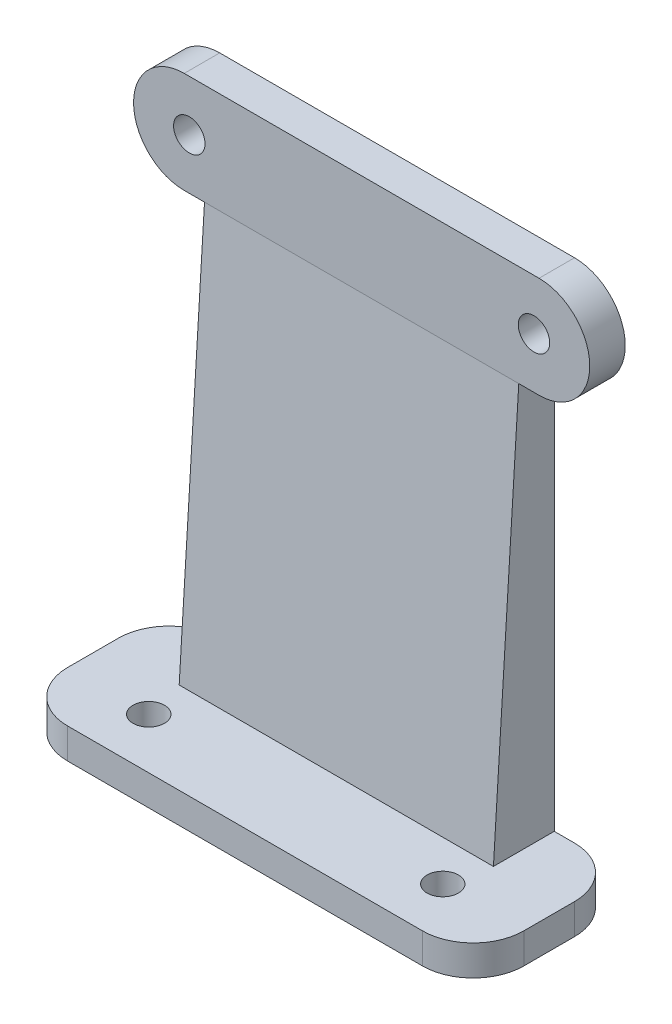
ISO-10303-21;
HEADER;
FILE_DESCRIPTION(('STEP AP214'),'2;1');
FILE_NAME('part.step','',(''),(''),'','','');
FILE_SCHEMA(('AUTOMOTIVE_DESIGN { 1 0 10303 214 1 1 1 1 }'));
ENDSEC;
DATA;
#1=APPLICATION_CONTEXT('core data for automotive mechanical design processes');
#2=APPLICATION_PROTOCOL_DEFINITION('international standard','automotive_design',2000,#1);
#3=PRODUCT_CONTEXT('',#1,'mechanical');
#4=PRODUCT('Part','Part','',(#3));
#5=PRODUCT_RELATED_PRODUCT_CATEGORY('part','',(#4));
#6=PRODUCT_DEFINITION_FORMATION('','',#4);
#7=PRODUCT_DEFINITION_CONTEXT('part definition',#1,'design');
#8=PRODUCT_DEFINITION('design','',#6,#7);
#9=PRODUCT_DEFINITION_SHAPE('','',#8);
#10=(LENGTH_UNIT() NAMED_UNIT(*) SI_UNIT(.MILLI.,.METRE.));
#11=(NAMED_UNIT(*) PLANE_ANGLE_UNIT() SI_UNIT($,.RADIAN.));
#12=(NAMED_UNIT(*) SI_UNIT($,.STERADIAN.) SOLID_ANGLE_UNIT());
#13=UNCERTAINTY_MEASURE_WITH_UNIT(LENGTH_MEASURE(1.E-05),#10,'distance_accuracy_value','');
#14=(GEOMETRIC_REPRESENTATION_CONTEXT(3) GLOBAL_UNCERTAINTY_ASSIGNED_CONTEXT((#13)) GLOBAL_UNIT_ASSIGNED_CONTEXT((#10,
#11,#12)) REPRESENTATION_CONTEXT('',''));
#15=CARTESIAN_POINT('',(0.,0.,0.));
#16=DIRECTION('',(0.,0.,1.));
#17=DIRECTION('',(1.,0.,0.));
#18=AXIS2_PLACEMENT_3D('',#15,#16,#17);
#19=CARTESIAN_POINT('',(0.,2.,0.));
#20=DIRECTION('',(0.,1.,0.));
#21=DIRECTION('',(0.,0.,1.));
#22=AXIS2_PLACEMENT_3D('',#19,#20,#21);
#23=PLANE('',#22);
#24=CARTESIAN_POINT('',(37.,2.,10.));
#25=DIRECTION('',(0.,1.,0.));
#26=DIRECTION('',(0.,0.,1.));
#27=AXIS2_PLACEMENT_3D('',#24,#25,#26);
#28=CIRCLE('',#27,1.55);
#29=CARTESIAN_POINT('',(37.,2.,11.55));
#30=VERTEX_POINT('',#29);
#31=EDGE_CURVE('E215',#30,#30,#28,.T.);
#32=ORIENTED_EDGE('',*,*,#31,.F.);
#33=EDGE_LOOP('',(#32));
#34=FACE_BOUND('',#33,.T.);
#35=CARTESIAN_POINT('',(8.,2.,10.));
#36=DIRECTION('',(0.,1.,0.));
#37=DIRECTION('',(0.,0.,1.));
#38=AXIS2_PLACEMENT_3D('',#35,#36,#37);
#39=CIRCLE('',#38,1.55);
#40=CARTESIAN_POINT('',(8.,2.,11.55));
#41=VERTEX_POINT('',#40);
#42=EDGE_CURVE('E209',#41,#41,#39,.T.);
#43=ORIENTED_EDGE('',*,*,#42,.F.);
#44=EDGE_LOOP('',(#43));
#45=FACE_BOUND('',#44,.T.);
#46=DIRECTION('',(1.,0.,0.));
#47=VECTOR('',#46,1.);
#48=CARTESIAN_POINT('',(0.,2.,15.));
#49=LINE('',#48,#47);
#50=CARTESIAN_POINT('',(5.,2.,15.));
#51=VERTEX_POINT('',#50);
#52=CARTESIAN_POINT('',(40.,2.,15.));
#53=VERTEX_POINT('',#52);
#54=EDGE_CURVE('E226',#51,#53,#49,.T.);
#55=ORIENTED_EDGE('',*,*,#54,.T.);
#56=CARTESIAN_POINT('',(40.,2.,10.));
#57=DIRECTION('',(0.,1.,0.));
#58=DIRECTION('',(0.,0.,1.));
#59=AXIS2_PLACEMENT_3D('',#56,#57,#58);
#60=CIRCLE('',#59,5.);
#61=CARTESIAN_POINT('',(45.,2.,10.));
#62=VERTEX_POINT('',#61);
#63=EDGE_CURVE('E280',#53,#62,#60,.T.);
#64=ORIENTED_EDGE('',*,*,#63,.T.);
#65=DIRECTION('',(0.,0.,-1.));
#66=VECTOR('',#65,1.);
#67=CARTESIAN_POINT('',(45.,2.,0.));
#68=LINE('',#67,#66);
#69=CARTESIAN_POINT('',(45.,2.,5.));
#70=VERTEX_POINT('',#69);
#71=EDGE_CURVE('E229',#62,#70,#68,.T.);
#72=ORIENTED_EDGE('',*,*,#71,.T.);
#73=CARTESIAN_POINT('',(40.,2.,5.));
#74=DIRECTION('',(0.,1.,0.));
#75=DIRECTION('',(0.,0.,1.));
#76=AXIS2_PLACEMENT_3D('',#73,#74,#75);
#77=CIRCLE('',#76,5.);
#78=CARTESIAN_POINT('',(40.,2.,0.));
#79=VERTEX_POINT('',#78);
#80=EDGE_CURVE('E276',#70,#79,#77,.T.);
#81=ORIENTED_EDGE('',*,*,#80,.T.);
#82=DIRECTION('',(-1.,0.,0.));
#83=VECTOR('',#82,1.);
#84=CARTESIAN_POINT('',(38.,2.,0.));
#85=LINE('',#84,#83);
#86=CARTESIAN_POINT('',(38.,2.,0.));
#87=VERTEX_POINT('',#86);
#88=EDGE_CURVE('E172',#79,#87,#85,.T.);
#89=ORIENTED_EDGE('',*,*,#88,.T.);
#90=DIRECTION('',(0.,0.,-1.));
#91=VECTOR('',#90,1.);
#92=CARTESIAN_POINT('',(38.,2.,10.));
#93=LINE('',#92,#91);
#94=CARTESIAN_POINT('',(38.,2.,6.));
#95=VERTEX_POINT('',#94);
#96=EDGE_CURVE('E160',#95,#87,#93,.T.);
#97=ORIENTED_EDGE('',*,*,#96,.F.);
#98=DIRECTION('',(-1.,0.,0.));
#99=VECTOR('',#98,1.);
#100=CARTESIAN_POINT('',(78.0780488547035,1.99999999999997,6.));
#101=LINE('',#100,#99);
#102=CARTESIAN_POINT('',(6.99999999999999,2.,6.));
#103=VERTEX_POINT('',#102);
#104=EDGE_CURVE('E306',#95,#103,#101,.T.);
#105=ORIENTED_EDGE('',*,*,#104,.T.);
#106=DIRECTION('',(0.,0.,-1.));
#107=VECTOR('',#106,1.);
#108=CARTESIAN_POINT('',(6.99999999999999,2.,10.));
#109=LINE('',#108,#107);
#110=CARTESIAN_POINT('',(6.99999999999999,2.,0.));
#111=VERTEX_POINT('',#110);
#112=EDGE_CURVE('E195',#103,#111,#109,.T.);
#113=ORIENTED_EDGE('',*,*,#112,.T.);
#114=DIRECTION('',(-1.,0.,0.));
#115=VECTOR('',#114,1.);
#116=CARTESIAN_POINT('',(6.99999999999999,2.,0.));
#117=LINE('',#116,#115);
#118=CARTESIAN_POINT('',(5.,2.,0.));
#119=VERTEX_POINT('',#118);
#120=EDGE_CURVE('E188',#111,#119,#117,.T.);
#121=ORIENTED_EDGE('',*,*,#120,.T.);
#122=CARTESIAN_POINT('',(5.,2.,5.));
#123=DIRECTION('',(0.,1.,0.));
#124=DIRECTION('',(0.,0.,1.));
#125=AXIS2_PLACEMENT_3D('',#122,#123,#124);
#126=CIRCLE('',#125,5.);
#127=CARTESIAN_POINT('',(0.,2.,5.));
#128=VERTEX_POINT('',#127);
#129=EDGE_CURVE('E274',#119,#128,#126,.T.);
#130=ORIENTED_EDGE('',*,*,#129,.T.);
#131=DIRECTION('',(0.,0.,1.));
#132=VECTOR('',#131,1.);
#133=CARTESIAN_POINT('',(0.,2.,0.));
#134=LINE('',#133,#132);
#135=CARTESIAN_POINT('',(0.,2.,10.));
#136=VERTEX_POINT('',#135);
#137=EDGE_CURVE('E223',#128,#136,#134,.T.);
#138=ORIENTED_EDGE('',*,*,#137,.T.);
#139=CARTESIAN_POINT('',(5.,2.,10.));
#140=DIRECTION('',(0.,1.,0.));
#141=DIRECTION('',(0.,0.,1.));
#142=AXIS2_PLACEMENT_3D('',#139,#140,#141);
#143=CIRCLE('',#142,5.);
#144=EDGE_CURVE('E278',#136,#51,#143,.T.);
#145=ORIENTED_EDGE('',*,*,#144,.T.);
#146=EDGE_LOOP('',(#55,#64,#72,#81,#89,#97,#105,#113,#121,#130,#138,#145));
#147=FACE_BOUND('',#146,.T.);
#148=ADVANCED_FACE('F40',(#34,#45,#147),#23,.T.);
#149=CARTESIAN_POINT('',(5.,47.,0.));
#150=DIRECTION('',(0.,0.,1.));
#151=DIRECTION('',(1.,0.,0.));
#152=AXIS2_PLACEMENT_3D('',#149,#150,#151);
#153=CYLINDRICAL_SURFACE('',#152,5.);
#154=DIRECTION('',(0.,0.,1.));
#155=VECTOR('',#154,1.);
#156=CARTESIAN_POINT('',(5.,52.,0.));
#157=LINE('',#156,#155);
#158=CARTESIAN_POINT('',(5.,52.,0.));
#159=VERTEX_POINT('',#158);
#160=CARTESIAN_POINT('',(4.99999999999999,52.,3.5));
#161=VERTEX_POINT('',#160);
#162=EDGE_CURVE('E259',#159,#161,#157,.T.);
#163=ORIENTED_EDGE('',*,*,#162,.F.);
#164=CARTESIAN_POINT('',(5.,47.,0.));
#165=DIRECTION('',(0.,0.,-1.));
#166=DIRECTION('',(-1.,0.,0.));
#167=AXIS2_PLACEMENT_3D('',#164,#165,#166);
#168=CIRCLE('',#167,5.);
#169=CARTESIAN_POINT('',(5.,42.,0.));
#170=VERTEX_POINT('',#169);
#171=EDGE_CURVE('E265',#170,#159,#168,.T.);
#172=ORIENTED_EDGE('',*,*,#171,.F.);
#173=DIRECTION('',(0.,0.,-1.));
#174=VECTOR('',#173,1.);
#175=CARTESIAN_POINT('',(5.,42.,0.));
#176=LINE('',#175,#174);
#177=CARTESIAN_POINT('',(5.,42.,3.5));
#178=VERTEX_POINT('',#177);
#179=EDGE_CURVE('E262',#178,#170,#176,.T.);
#180=ORIENTED_EDGE('',*,*,#179,.F.);
#181=CARTESIAN_POINT('',(5.,47.,3.5));
#182=DIRECTION('',(0.,0.,-1.));
#183=DIRECTION('',(-1.,0.,0.));
#184=AXIS2_PLACEMENT_3D('',#181,#182,#183);
#185=CIRCLE('',#184,5.);
#186=EDGE_CURVE('E267',#161,#178,#185,.F.);
#187=ORIENTED_EDGE('',*,*,#186,.F.);
#188=EDGE_LOOP('',(#163,#172,#180,#187));
#189=FACE_BOUND('',#188,.T.);
#190=ADVANCED_FACE('F320',(#189),#153,.T.);
#191=CARTESIAN_POINT('',(40.,47.,3.5));
#192=DIRECTION('',(0.,0.,-1.));
#193=DIRECTION('',(-1.,0.,0.));
#194=AXIS2_PLACEMENT_3D('',#191,#192,#193);
#195=CYLINDRICAL_SURFACE('',#194,5.);
#196=DIRECTION('',(0.,0.,-1.));
#197=VECTOR('',#196,1.);
#198=CARTESIAN_POINT('',(40.,52.,0.));
#199=LINE('',#198,#197);
#200=CARTESIAN_POINT('',(40.,52.,3.5));
#201=VERTEX_POINT('',#200);
#202=CARTESIAN_POINT('',(40.,52.,0.));
#203=VERTEX_POINT('',#202);
#204=EDGE_CURVE('E250',#201,#203,#199,.T.);
#205=ORIENTED_EDGE('',*,*,#204,.F.);
#206=CARTESIAN_POINT('',(40.,47.,3.5));
#207=DIRECTION('',(0.,0.,-1.));
#208=DIRECTION('',(-1.,0.,0.));
#209=AXIS2_PLACEMENT_3D('',#206,#207,#208);
#210=CIRCLE('',#209,5.);
#211=CARTESIAN_POINT('',(40.,42.,3.5));
#212=VERTEX_POINT('',#211);
#213=EDGE_CURVE('E255',#212,#201,#210,.F.);
#214=ORIENTED_EDGE('',*,*,#213,.F.);
#215=DIRECTION('',(0.,0.,1.));
#216=VECTOR('',#215,1.);
#217=CARTESIAN_POINT('',(40.,42.,3.5));
#218=LINE('',#217,#216);
#219=CARTESIAN_POINT('',(40.,42.,0.));
#220=VERTEX_POINT('',#219);
#221=EDGE_CURVE('E253',#220,#212,#218,.T.);
#222=ORIENTED_EDGE('',*,*,#221,.F.);
#223=CARTESIAN_POINT('',(40.,47.,0.));
#224=DIRECTION('',(0.,0.,-1.));
#225=DIRECTION('',(-1.,0.,0.));
#226=AXIS2_PLACEMENT_3D('',#223,#224,#225);
#227=CIRCLE('',#226,5.);
#228=EDGE_CURVE('E177',#203,#220,#227,.T.);
#229=ORIENTED_EDGE('',*,*,#228,.F.);
#230=EDGE_LOOP('',(#205,#214,#222,#229));
#231=FACE_BOUND('',#230,.T.);
#232=ADVANCED_FACE('F326',(#231),#195,.T.);
#233=CARTESIAN_POINT('',(45.,-1.,0.));
#234=DIRECTION('',(1.,0.,0.));
#235=DIRECTION('',(0.,0.,-1.));
#236=AXIS2_PLACEMENT_3D('',#233,#234,#235);
#237=PLANE('',#236);
#238=ORIENTED_EDGE('',*,*,#71,.F.);
#239=DIRECTION('',(0.,1.,0.));
#240=VECTOR('',#239,1.);
#241=CARTESIAN_POINT('',(45.,-1.,10.));
#242=LINE('',#241,#240);
#243=CARTESIAN_POINT('',(45.,-1.,10.));
#244=VERTEX_POINT('',#243);
#245=EDGE_CURVE('E285',#62,#244,#242,.F.);
#246=ORIENTED_EDGE('',*,*,#245,.T.);
#247=DIRECTION('',(0.,0.,-1.));
#248=VECTOR('',#247,1.);
#249=CARTESIAN_POINT('',(45.,-1.,0.));
#250=LINE('',#249,#248);
#251=CARTESIAN_POINT('',(45.,-1.,5.));
#252=VERTEX_POINT('',#251);
#253=EDGE_CURVE('E238',#244,#252,#250,.T.);
#254=ORIENTED_EDGE('',*,*,#253,.T.);
#255=DIRECTION('',(0.,1.,0.));
#256=VECTOR('',#255,1.);
#257=CARTESIAN_POINT('',(45.,-1.,5.));
#258=LINE('',#257,#256);
#259=EDGE_CURVE('E282',#252,#70,#258,.T.);
#260=ORIENTED_EDGE('',*,*,#259,.T.);
#261=EDGE_LOOP('',(#238,#246,#254,#260));
#262=FACE_BOUND('',#261,.T.);
#263=ADVANCED_FACE('F367',(#262),#237,.T.);
#264=CARTESIAN_POINT('',(0.,-1.,0.));
#265=DIRECTION('',(0.,0.,-1.));
#266=DIRECTION('',(-1.,0.,0.));
#267=AXIS2_PLACEMENT_3D('',#264,#265,#266);
#268=PLANE('',#267);
#269=ORIENTED_EDGE('',*,*,#88,.F.);
#270=DIRECTION('',(0.,1.,0.));
#271=VECTOR('',#270,1.);
#272=CARTESIAN_POINT('',(40.,-1.,0.));
#273=LINE('',#272,#271);
#274=CARTESIAN_POINT('',(40.,-1.,0.));
#275=VERTEX_POINT('',#274);
#276=EDGE_CURVE('E11',#79,#275,#273,.F.);
#277=ORIENTED_EDGE('',*,*,#276,.T.);
#278=DIRECTION('',(-1.,0.,0.));
#279=VECTOR('',#278,1.);
#280=CARTESIAN_POINT('',(0.,-1.,0.));
#281=LINE('',#280,#279);
#282=CARTESIAN_POINT('',(5.,-1.,0.));
#283=VERTEX_POINT('',#282);
#284=EDGE_CURVE('E241',#275,#283,#281,.T.);
#285=ORIENTED_EDGE('',*,*,#284,.T.);
#286=DIRECTION('',(0.,1.,0.));
#287=VECTOR('',#286,1.);
#288=CARTESIAN_POINT('',(5.,-1.,0.));
#289=LINE('',#288,#287);
#290=EDGE_CURVE('E48',#283,#119,#289,.T.);
#291=ORIENTED_EDGE('',*,*,#290,.T.);
#292=ORIENTED_EDGE('',*,*,#120,.F.);
#293=DIRECTION('',(0.,-1.,0.));
#294=VECTOR('',#293,1.);
#295=CARTESIAN_POINT('',(7.,42.,0.));
#296=LINE('',#295,#294);
#297=CARTESIAN_POINT('',(7.,42.,0.));
#298=VERTEX_POINT('',#297);
#299=EDGE_CURVE('E185',#298,#111,#296,.T.);
#300=ORIENTED_EDGE('',*,*,#299,.F.);
#301=DIRECTION('',(1.,0.,0.));
#302=VECTOR('',#301,1.);
#303=CARTESIAN_POINT('',(7.,42.,0.));
#304=LINE('',#303,#302);
#305=EDGE_CURVE('E192',#170,#298,#304,.T.);
#306=ORIENTED_EDGE('',*,*,#305,.F.);
#307=ORIENTED_EDGE('',*,*,#171,.T.);
#308=DIRECTION('',(-1.,0.,0.));
#309=VECTOR('',#308,1.);
#310=CARTESIAN_POINT('',(0.,52.,0.));
#311=LINE('',#310,#309);
#312=EDGE_CURVE('E220',#203,#159,#311,.T.);
#313=ORIENTED_EDGE('',*,*,#312,.F.);
#314=ORIENTED_EDGE('',*,*,#228,.T.);
#315=DIRECTION('',(1.,0.,0.));
#316=VECTOR('',#315,1.);
#317=CARTESIAN_POINT('',(38.,42.,0.));
#318=LINE('',#317,#316);
#319=CARTESIAN_POINT('',(38.,42.,0.));
#320=VERTEX_POINT('',#319);
#321=EDGE_CURVE('E162',#320,#220,#318,.T.);
#322=ORIENTED_EDGE('',*,*,#321,.F.);
#323=DIRECTION('',(0.,1.,0.));
#324=VECTOR('',#323,1.);
#325=CARTESIAN_POINT('',(38.,42.,0.));
#326=LINE('',#325,#324);
#327=EDGE_CURVE('E154',#87,#320,#326,.T.);
#328=ORIENTED_EDGE('',*,*,#327,.F.);
#329=EDGE_LOOP('',(#269,#277,#285,#291,#292,#300,#306,#307,#313,#314,#322,#328));
#330=FACE_BOUND('',#329,.T.);
#331=CARTESIAN_POINT('',(39.5,47.,0.));
#332=DIRECTION('',(0.,0.,-1.));
#333=DIRECTION('',(-1.,0.,0.));
#334=AXIS2_PLACEMENT_3D('',#331,#332,#333);
#335=CIRCLE('',#334,1.55);
#336=CARTESIAN_POINT('',(37.95,47.,0.));
#337=VERTEX_POINT('',#336);
#338=EDGE_CURVE('E199',#337,#337,#335,.T.);
#339=ORIENTED_EDGE('',*,*,#338,.F.);
#340=EDGE_LOOP('',(#339));
#341=FACE_BOUND('',#340,.T.);
#342=CARTESIAN_POINT('',(5.5,47.,0.));
#343=DIRECTION('',(0.,0.,-1.));
#344=DIRECTION('',(-1.,0.,0.));
#345=AXIS2_PLACEMENT_3D('',#342,#343,#344);
#346=CIRCLE('',#345,1.55);
#347=CARTESIAN_POINT('',(3.95,47.,0.));
#348=VERTEX_POINT('',#347);
#349=EDGE_CURVE('E183',#348,#348,#346,.T.);
#350=ORIENTED_EDGE('',*,*,#349,.F.);
#351=EDGE_LOOP('',(#350));
#352=FACE_BOUND('',#351,.T.);
#353=ADVANCED_FACE('F174',(#330,#341,#352),#268,.T.);
#354=CARTESIAN_POINT('',(0.,-1.,0.));
#355=DIRECTION('',(-1.,0.,0.));
#356=DIRECTION('',(0.,0.,1.));
#357=AXIS2_PLACEMENT_3D('',#354,#355,#356);
#358=PLANE('',#357);
#359=DIRECTION('',(0.,0.,1.));
#360=VECTOR('',#359,1.);
#361=CARTESIAN_POINT('',(0.,-1.,0.));
#362=LINE('',#361,#360);
#363=CARTESIAN_POINT('',(0.,-1.,5.));
#364=VERTEX_POINT('',#363);
#365=CARTESIAN_POINT('',(0.,-1.,10.));
#366=VERTEX_POINT('',#365);
#367=EDGE_CURVE('E232',#364,#366,#362,.T.);
#368=ORIENTED_EDGE('',*,*,#367,.T.);
#369=DIRECTION('',(0.,1.,0.));
#370=VECTOR('',#369,1.);
#371=CARTESIAN_POINT('',(0.,-1.,10.));
#372=LINE('',#371,#370);
#373=EDGE_CURVE('E296',#366,#136,#372,.T.);
#374=ORIENTED_EDGE('',*,*,#373,.T.);
#375=ORIENTED_EDGE('',*,*,#137,.F.);
#376=DIRECTION('',(0.,1.,0.));
#377=VECTOR('',#376,1.);
#378=CARTESIAN_POINT('',(0.,-1.,5.));
#379=LINE('',#378,#377);
#380=EDGE_CURVE('E294',#128,#364,#379,.F.);
#381=ORIENTED_EDGE('',*,*,#380,.T.);
#382=EDGE_LOOP('',(#368,#374,#375,#381));
#383=FACE_BOUND('',#382,.T.);
#384=ADVANCED_FACE('F366',(#383),#358,.T.);
#385=CARTESIAN_POINT('',(0.,-1.,15.));
#386=DIRECTION('',(0.,0.,1.));
#387=DIRECTION('',(1.,0.,0.));
#388=AXIS2_PLACEMENT_3D('',#385,#386,#387);
#389=PLANE('',#388);
#390=DIRECTION('',(1.,0.,0.));
#391=VECTOR('',#390,1.);
#392=CARTESIAN_POINT('',(0.,-1.,15.));
#393=LINE('',#392,#391);
#394=CARTESIAN_POINT('',(5.,-1.,15.));
#395=VERTEX_POINT('',#394);
#396=CARTESIAN_POINT('',(40.,-1.,15.));
#397=VERTEX_POINT('',#396);
#398=EDGE_CURVE('E235',#395,#397,#393,.T.);
#399=ORIENTED_EDGE('',*,*,#398,.T.);
#400=DIRECTION('',(0.,1.,0.));
#401=VECTOR('',#400,1.);
#402=CARTESIAN_POINT('',(40.,-1.,15.));
#403=LINE('',#402,#401);
#404=EDGE_CURVE('E271',#397,#53,#403,.T.);
#405=ORIENTED_EDGE('',*,*,#404,.T.);
#406=ORIENTED_EDGE('',*,*,#54,.F.);
#407=DIRECTION('',(0.,1.,0.));
#408=VECTOR('',#407,1.);
#409=CARTESIAN_POINT('',(5.,-1.,15.));
#410=LINE('',#409,#408);
#411=EDGE_CURVE('E269',#51,#395,#410,.F.);
#412=ORIENTED_EDGE('',*,*,#411,.T.);
#413=EDGE_LOOP('',(#399,#405,#406,#412));
#414=FACE_BOUND('',#413,.T.);
#415=ADVANCED_FACE('F362',(#414),#389,.T.);
#416=CARTESIAN_POINT('',(0.,-1.,0.));
#417=DIRECTION('',(0.,1.,0.));
#418=DIRECTION('',(0.,0.,1.));
#419=AXIS2_PLACEMENT_3D('',#416,#417,#418);
#420=PLANE('',#419);
#421=CARTESIAN_POINT('',(8.,-1.,10.));
#422=DIRECTION('',(0.,1.,0.));
#423=DIRECTION('',(0.,0.,1.));
#424=AXIS2_PLACEMENT_3D('',#421,#422,#423);
#425=CIRCLE('',#424,1.55);
#426=CARTESIAN_POINT('',(8.,-1.,11.55));
#427=VERTEX_POINT('',#426);
#428=EDGE_CURVE('E205',#427,#427,#425,.T.);
#429=ORIENTED_EDGE('',*,*,#428,.T.);
#430=EDGE_LOOP('',(#429));
#431=FACE_BOUND('',#430,.T.);
#432=CARTESIAN_POINT('',(37.,-1.,10.));
#433=DIRECTION('',(0.,1.,0.));
#434=DIRECTION('',(0.,0.,1.));
#435=AXIS2_PLACEMENT_3D('',#432,#433,#434);
#436=CIRCLE('',#435,1.55);
#437=CARTESIAN_POINT('',(37.,-1.,11.55));
#438=VERTEX_POINT('',#437);
#439=EDGE_CURVE('E212',#438,#438,#436,.T.);
#440=ORIENTED_EDGE('',*,*,#439,.T.);
#441=EDGE_LOOP('',(#440));
#442=FACE_BOUND('',#441,.T.);
#443=ORIENTED_EDGE('',*,*,#253,.F.);
#444=CARTESIAN_POINT('',(40.,-1.,10.));
#445=DIRECTION('',(0.,1.,0.));
#446=DIRECTION('',(0.,0.,1.));
#447=AXIS2_PLACEMENT_3D('',#444,#445,#446);
#448=CIRCLE('',#447,5.);
#449=EDGE_CURVE('E292',#244,#397,#448,.F.);
#450=ORIENTED_EDGE('',*,*,#449,.T.);
#451=ORIENTED_EDGE('',*,*,#398,.F.);
#452=CARTESIAN_POINT('',(5.,-1.,10.));
#453=DIRECTION('',(0.,1.,0.));
#454=DIRECTION('',(0.,0.,1.));
#455=AXIS2_PLACEMENT_3D('',#452,#453,#454);
#456=CIRCLE('',#455,5.);
#457=EDGE_CURVE('E290',#395,#366,#456,.F.);
#458=ORIENTED_EDGE('',*,*,#457,.T.);
#459=ORIENTED_EDGE('',*,*,#367,.F.);
#460=CARTESIAN_POINT('',(5.,-1.,5.));
#461=DIRECTION('',(0.,1.,0.));
#462=DIRECTION('',(0.,0.,1.));
#463=AXIS2_PLACEMENT_3D('',#460,#461,#462);
#464=CIRCLE('',#463,5.);
#465=EDGE_CURVE('E55',#364,#283,#464,.F.);
#466=ORIENTED_EDGE('',*,*,#465,.T.);
#467=ORIENTED_EDGE('',*,*,#284,.F.);
#468=CARTESIAN_POINT('',(40.,-1.,5.));
#469=DIRECTION('',(0.,1.,0.));
#470=DIRECTION('',(0.,0.,1.));
#471=AXIS2_PLACEMENT_3D('',#468,#469,#470);
#472=CIRCLE('',#471,5.);
#473=EDGE_CURVE('E288',#275,#252,#472,.F.);
#474=ORIENTED_EDGE('',*,*,#473,.T.);
#475=EDGE_LOOP('',(#443,#450,#451,#458,#459,#466,#467,#474));
#476=FACE_BOUND('',#475,.T.);
#477=ADVANCED_FACE('F359',(#431,#442,#476),#420,.F.);
#478=CARTESIAN_POINT('',(0.,52.,3.5));
#479=DIRECTION('',(0.,0.,-1.));
#480=DIRECTION('',(-1.,0.,0.));
#481=AXIS2_PLACEMENT_3D('',#478,#479,#480);
#482=PLANE('',#481);
#483=CARTESIAN_POINT('',(39.5,47.,3.5));
#484=DIRECTION('',(0.,0.,-1.));
#485=DIRECTION('',(-1.,0.,0.));
#486=AXIS2_PLACEMENT_3D('',#483,#484,#485);
#487=CIRCLE('',#486,1.55);
#488=CARTESIAN_POINT('',(37.95,47.,3.5));
#489=VERTEX_POINT('',#488);
#490=EDGE_CURVE('E218',#489,#489,#487,.T.);
#491=ORIENTED_EDGE('',*,*,#490,.T.);
#492=EDGE_LOOP('',(#491));
#493=FACE_BOUND('',#492,.T.);
#494=CARTESIAN_POINT('',(5.5,47.,3.5));
#495=DIRECTION('',(0.,0.,-1.));
#496=DIRECTION('',(-1.,0.,0.));
#497=AXIS2_PLACEMENT_3D('',#494,#495,#496);
#498=CIRCLE('',#497,1.55);
#499=CARTESIAN_POINT('',(3.95,47.,3.5));
#500=VERTEX_POINT('',#499);
#501=EDGE_CURVE('E202',#500,#500,#498,.T.);
#502=ORIENTED_EDGE('',*,*,#501,.T.);
#503=EDGE_LOOP('',(#502));
#504=FACE_BOUND('',#503,.T.);
#505=DIRECTION('',(1.,0.,0.));
#506=VECTOR('',#505,1.);
#507=CARTESIAN_POINT('',(0.,42.,3.5));
#508=LINE('',#507,#506);
#509=CARTESIAN_POINT('',(7.,42.,3.5));
#510=VERTEX_POINT('',#509);
#511=EDGE_CURVE('E243',#178,#510,#508,.T.);
#512=ORIENTED_EDGE('',*,*,#511,.T.);
#513=DIRECTION('',(-1.,0.,0.));
#514=VECTOR('',#513,1.);
#515=CARTESIAN_POINT('',(78.0780488547035,42.,3.5));
#516=LINE('',#515,#514);
#517=CARTESIAN_POINT('',(38.,42.,3.5));
#518=VERTEX_POINT('',#517);
#519=EDGE_CURVE('E329',#518,#510,#516,.T.);
#520=ORIENTED_EDGE('',*,*,#519,.F.);
#521=DIRECTION('',(1.,0.,0.));
#522=VECTOR('',#521,1.);
#523=CARTESIAN_POINT('',(0.,42.,3.5));
#524=LINE('',#523,#522);
#525=EDGE_CURVE('E171',#518,#212,#524,.T.);
#526=ORIENTED_EDGE('',*,*,#525,.T.);
#527=ORIENTED_EDGE('',*,*,#213,.T.);
#528=DIRECTION('',(1.,0.,0.));
#529=VECTOR('',#528,1.);
#530=CARTESIAN_POINT('',(0.,52.,3.5));
#531=LINE('',#530,#529);
#532=EDGE_CURVE('E208',#161,#201,#531,.T.);
#533=ORIENTED_EDGE('',*,*,#532,.F.);
#534=ORIENTED_EDGE('',*,*,#186,.T.);
#535=EDGE_LOOP('',(#512,#520,#526,#527,#533,#534));
#536=FACE_BOUND('',#535,.T.);
#537=ADVANCED_FACE('F328',(#493,#504,#536),#482,.F.);
#538=CARTESIAN_POINT('',(0.,52.,0.));
#539=DIRECTION('',(0.,1.,0.));
#540=DIRECTION('',(0.,0.,1.));
#541=AXIS2_PLACEMENT_3D('',#538,#539,#540);
#542=PLANE('',#541);
#543=ORIENTED_EDGE('',*,*,#312,.T.);
#544=ORIENTED_EDGE('',*,*,#162,.T.);
#545=ORIENTED_EDGE('',*,*,#532,.T.);
#546=ORIENTED_EDGE('',*,*,#204,.T.);
#547=EDGE_LOOP('',(#543,#544,#545,#546));
#548=FACE_BOUND('',#547,.T.);
#549=ADVANCED_FACE('F322',(#548),#542,.T.);
#550=CARTESIAN_POINT('',(37.,-1.,10.));
#551=DIRECTION('',(0.,1.,0.));
#552=DIRECTION('',(0.,0.,1.));
#553=AXIS2_PLACEMENT_3D('',#550,#551,#552);
#554=CYLINDRICAL_SURFACE('',#553,1.55);
#555=ORIENTED_EDGE('',*,*,#439,.F.);
#556=EDGE_LOOP('',(#555));
#557=FACE_BOUND('',#556,.T.);
#558=ORIENTED_EDGE('',*,*,#31,.T.);
#559=EDGE_LOOP('',(#558));
#560=FACE_BOUND('',#559,.T.);
#561=ADVANCED_FACE('F532',(#557,#560),#554,.F.);
#562=CARTESIAN_POINT('',(8.,-1.,10.));
#563=DIRECTION('',(0.,1.,0.));
#564=DIRECTION('',(0.,0.,1.));
#565=AXIS2_PLACEMENT_3D('',#562,#563,#564);
#566=CYLINDRICAL_SURFACE('',#565,1.55);
#567=ORIENTED_EDGE('',*,*,#428,.F.);
#568=EDGE_LOOP('',(#567));
#569=FACE_BOUND('',#568,.T.);
#570=ORIENTED_EDGE('',*,*,#42,.T.);
#571=EDGE_LOOP('',(#570));
#572=FACE_BOUND('',#571,.T.);
#573=ADVANCED_FACE('F538',(#569,#572),#566,.F.);
#574=CARTESIAN_POINT('',(5.5,47.,15.));
#575=DIRECTION('',(0.,0.,-1.));
#576=DIRECTION('',(-1.,0.,0.));
#577=AXIS2_PLACEMENT_3D('',#574,#575,#576);
#578=CYLINDRICAL_SURFACE('',#577,1.55);
#579=ORIENTED_EDGE('',*,*,#349,.T.);
#580=EDGE_LOOP('',(#579));
#581=FACE_BOUND('',#580,.T.);
#582=ORIENTED_EDGE('',*,*,#501,.F.);
#583=EDGE_LOOP('',(#582));
#584=FACE_BOUND('',#583,.T.);
#585=ADVANCED_FACE('F543',(#581,#584),#578,.F.);
#586=CARTESIAN_POINT('',(39.5,47.,15.));
#587=DIRECTION('',(0.,0.,-1.));
#588=DIRECTION('',(-1.,0.,0.));
#589=AXIS2_PLACEMENT_3D('',#586,#587,#588);
#590=CYLINDRICAL_SURFACE('',#589,1.55);
#591=ORIENTED_EDGE('',*,*,#338,.T.);
#592=EDGE_LOOP('',(#591));
#593=FACE_BOUND('',#592,.T.);
#594=ORIENTED_EDGE('',*,*,#490,.F.);
#595=EDGE_LOOP('',(#594));
#596=FACE_BOUND('',#595,.T.);
#597=ADVANCED_FACE('F504',(#593,#596),#590,.F.);
#598=CARTESIAN_POINT('',(38.,42.,-10.));
#599=DIRECTION('',(-1.,0.,0.));
#600=DIRECTION('',(0.,0.,1.));
#601=AXIS2_PLACEMENT_3D('',#598,#599,#600);
#602=PLANE('',#601);
#603=ORIENTED_EDGE('',*,*,#327,.T.);
#604=DIRECTION('',(0.,0.,-1.));
#605=VECTOR('',#604,1.);
#606=CARTESIAN_POINT('',(38.,42.,10.));
#607=LINE('',#606,#605);
#608=EDGE_CURVE('E158',#518,#320,#607,.T.);
#609=ORIENTED_EDGE('',*,*,#608,.F.);
#610=DIRECTION('',(0.,-0.998052578482889,0.0623782861551805));
#611=VECTOR('',#610,1.);
#612=CARTESIAN_POINT('',(38.,42.,3.5));
#613=LINE('',#612,#611);
#614=EDGE_CURVE('E189',#518,#95,#613,.T.);
#615=ORIENTED_EDGE('',*,*,#614,.T.);
#616=ORIENTED_EDGE('',*,*,#96,.T.);
#617=EDGE_LOOP('',(#603,#609,#615,#616));
#618=FACE_BOUND('',#617,.T.);
#619=ADVANCED_FACE('F156',(#618),#602,.F.);
#620=CARTESIAN_POINT('',(7.,42.,-10.));
#621=DIRECTION('',(1.,0.,0.));
#622=DIRECTION('',(0.,1.,0.));
#623=AXIS2_PLACEMENT_3D('',#620,#621,#622);
#624=PLANE('',#623);
#625=DIRECTION('',(0.,0.,-1.));
#626=VECTOR('',#625,1.);
#627=CARTESIAN_POINT('',(7.,42.,10.));
#628=LINE('',#627,#626);
#629=EDGE_CURVE('E163',#510,#298,#628,.T.);
#630=ORIENTED_EDGE('',*,*,#629,.T.);
#631=ORIENTED_EDGE('',*,*,#299,.T.);
#632=ORIENTED_EDGE('',*,*,#112,.F.);
#633=DIRECTION('',(0.,0.998052578482889,-0.0623782861551805));
#634=VECTOR('',#633,1.);
#635=CARTESIAN_POINT('',(7.,42.,3.5));
#636=LINE('',#635,#634);
#637=EDGE_CURVE('E333',#103,#510,#636,.T.);
#638=ORIENTED_EDGE('',*,*,#637,.T.);
#639=EDGE_LOOP('',(#630,#631,#632,#638));
#640=FACE_BOUND('',#639,.T.);
#641=ADVANCED_FACE('F310',(#640),#624,.F.);
#642=CARTESIAN_POINT('',(7.,42.,10.));
#643=DIRECTION('',(0.,1.,0.));
#644=DIRECTION('',(0.,0.,1.));
#645=AXIS2_PLACEMENT_3D('',#642,#643,#644);
#646=PLANE('',#645);
#647=ORIENTED_EDGE('',*,*,#511,.F.);
#648=ORIENTED_EDGE('',*,*,#179,.T.);
#649=ORIENTED_EDGE('',*,*,#305,.T.);
#650=ORIENTED_EDGE('',*,*,#629,.F.);
#651=EDGE_LOOP('',(#647,#648,#649,#650));
#652=FACE_BOUND('',#651,.T.);
#653=ADVANCED_FACE('F315',(#652),#646,.F.);
#654=CARTESIAN_POINT('',(38.,42.,10.));
#655=DIRECTION('',(0.,1.,0.));
#656=DIRECTION('',(0.,0.,1.));
#657=AXIS2_PLACEMENT_3D('',#654,#655,#656);
#658=PLANE('',#657);
#659=ORIENTED_EDGE('',*,*,#321,.T.);
#660=ORIENTED_EDGE('',*,*,#221,.T.);
#661=ORIENTED_EDGE('',*,*,#525,.F.);
#662=ORIENTED_EDGE('',*,*,#608,.T.);
#663=EDGE_LOOP('',(#659,#660,#661,#662));
#664=FACE_BOUND('',#663,.T.);
#665=ADVANCED_FACE('F168',(#664),#658,.F.);
#666=CARTESIAN_POINT('',(78.0780488547035,42.,3.5));
#667=DIRECTION('',(0.,0.0623782861551805,0.998052578482889));
#668=DIRECTION('',(0.,-0.998052578482889,0.0623782861551805));
#669=AXIS2_PLACEMENT_3D('',#666,#667,#668);
#670=PLANE('',#669);
#671=ORIENTED_EDGE('',*,*,#614,.F.);
#672=ORIENTED_EDGE('',*,*,#519,.T.);
#673=ORIENTED_EDGE('',*,*,#637,.F.);
#674=ORIENTED_EDGE('',*,*,#104,.F.);
#675=EDGE_LOOP('',(#671,#672,#673,#674));
#676=FACE_BOUND('',#675,.T.);
#677=ADVANCED_FACE('F335',(#676),#670,.T.);
#678=CARTESIAN_POINT('',(40.,-1.,10.));
#679=DIRECTION('',(0.,1.,0.));
#680=DIRECTION('',(0.,0.,1.));
#681=AXIS2_PLACEMENT_3D('',#678,#679,#680);
#682=CYLINDRICAL_SURFACE('',#681,5.);
#683=ORIENTED_EDGE('',*,*,#449,.F.);
#684=ORIENTED_EDGE('',*,*,#245,.F.);
#685=ORIENTED_EDGE('',*,*,#63,.F.);
#686=ORIENTED_EDGE('',*,*,#404,.F.);
#687=EDGE_LOOP('',(#683,#684,#685,#686));
#688=FACE_BOUND('',#687,.T.);
#689=ADVANCED_FACE('F337',(#688),#682,.T.);
#690=CARTESIAN_POINT('',(5.,-1.,10.));
#691=DIRECTION('',(0.,1.,0.));
#692=DIRECTION('',(0.,0.,1.));
#693=AXIS2_PLACEMENT_3D('',#690,#691,#692);
#694=CYLINDRICAL_SURFACE('',#693,5.);
#695=ORIENTED_EDGE('',*,*,#457,.F.);
#696=ORIENTED_EDGE('',*,*,#411,.F.);
#697=ORIENTED_EDGE('',*,*,#144,.F.);
#698=ORIENTED_EDGE('',*,*,#373,.F.);
#699=EDGE_LOOP('',(#695,#696,#697,#698));
#700=FACE_BOUND('',#699,.T.);
#701=ADVANCED_FACE('F343',(#700),#694,.T.);
#702=CARTESIAN_POINT('',(40.,-1.,5.));
#703=DIRECTION('',(0.,1.,0.));
#704=DIRECTION('',(0.,0.,1.));
#705=AXIS2_PLACEMENT_3D('',#702,#703,#704);
#706=CYLINDRICAL_SURFACE('',#705,5.);
#707=ORIENTED_EDGE('',*,*,#473,.F.);
#708=ORIENTED_EDGE('',*,*,#276,.F.);
#709=ORIENTED_EDGE('',*,*,#80,.F.);
#710=ORIENTED_EDGE('',*,*,#259,.F.);
#711=EDGE_LOOP('',(#707,#708,#709,#710));
#712=FACE_BOUND('',#711,.T.);
#713=ADVANCED_FACE('F386',(#712),#706,.T.);
#714=CARTESIAN_POINT('',(5.,-1.,5.));
#715=DIRECTION('',(0.,1.,0.));
#716=DIRECTION('',(0.,0.,1.));
#717=AXIS2_PLACEMENT_3D('',#714,#715,#716);
#718=CYLINDRICAL_SURFACE('',#717,5.);
#719=ORIENTED_EDGE('',*,*,#465,.F.);
#720=ORIENTED_EDGE('',*,*,#380,.F.);
#721=ORIENTED_EDGE('',*,*,#129,.F.);
#722=ORIENTED_EDGE('',*,*,#290,.F.);
#723=EDGE_LOOP('',(#719,#720,#721,#722));
#724=FACE_BOUND('',#723,.T.);
#725=ADVANCED_FACE('F42',(#724),#718,.T.);
#726=CLOSED_SHELL('',(#148,#190,#232,#263,#353,#384,#415,#477,#537,#549,#561,#573,#585,#597,
#619,#641,#653,#665,#677,#689,#701,#713,#725));
#727=MANIFOLD_SOLID_BREP('B2',#726);
#728=ADVANCED_BREP_SHAPE_REPRESENTATION('',(#18,#727),#14);
#729=SHAPE_DEFINITION_REPRESENTATION(#9,#728);
ENDSEC;
END-ISO-10303-21;
